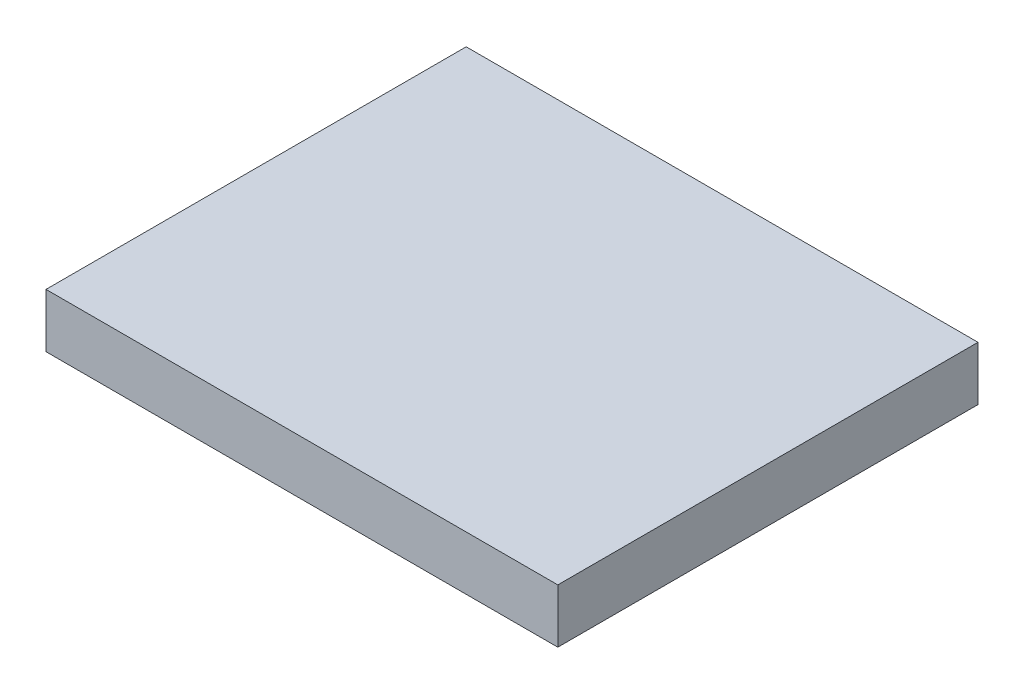
ISO-10303-21;
HEADER;
FILE_DESCRIPTION(('STEP AP214'),'2;1');
FILE_NAME('part.step','',(''),(''),'','','');
FILE_SCHEMA(('AUTOMOTIVE_DESIGN { 1 0 10303 214 1 1 1 1 }'));
ENDSEC;
DATA;
#1=APPLICATION_CONTEXT('core data for automotive mechanical design processes');
#2=APPLICATION_PROTOCOL_DEFINITION('international standard','automotive_design',2000,#1);
#3=PRODUCT_CONTEXT('',#1,'mechanical');
#4=PRODUCT('Part','Part','',(#3));
#5=PRODUCT_RELATED_PRODUCT_CATEGORY('part','',(#4));
#6=PRODUCT_DEFINITION_FORMATION('','',#4);
#7=PRODUCT_DEFINITION_CONTEXT('part definition',#1,'design');
#8=PRODUCT_DEFINITION('design','',#6,#7);
#9=PRODUCT_DEFINITION_SHAPE('','',#8);
#10=(LENGTH_UNIT() NAMED_UNIT(*) SI_UNIT(.MILLI.,.METRE.));
#11=(NAMED_UNIT(*) PLANE_ANGLE_UNIT() SI_UNIT($,.RADIAN.));
#12=(NAMED_UNIT(*) SI_UNIT($,.STERADIAN.) SOLID_ANGLE_UNIT());
#13=UNCERTAINTY_MEASURE_WITH_UNIT(LENGTH_MEASURE(1.E-05),#10,'distance_accuracy_value','');
#14=(GEOMETRIC_REPRESENTATION_CONTEXT(3) GLOBAL_UNCERTAINTY_ASSIGNED_CONTEXT((#13)) GLOBAL_UNIT_ASSIGNED_CONTEXT((#10,
#11,#12)) REPRESENTATION_CONTEXT('',''));
#15=CARTESIAN_POINT('',(0.,0.,0.));
#16=DIRECTION('',(0.,0.,1.));
#17=DIRECTION('',(1.,0.,0.));
#18=AXIS2_PLACEMENT_3D('',#15,#16,#17);
#19=CARTESIAN_POINT('',(-25.810949176075,5.874618009437,0.));
#20=DIRECTION('',(1.,0.,0.));
#21=DIRECTION('',(0.,1.,0.));
#22=AXIS2_PLACEMENT_3D('',#19,#20,#21);
#23=PLANE('',#22);
#24=DIRECTION('',(0.,-1.,0.));
#25=VECTOR('',#24,1.);
#26=CARTESIAN_POINT('',(-25.810949176075,5.887465362914,0.));
#27=LINE('',#26,#25);
#28=CARTESIAN_POINT('',(-25.810949176075,5.887465362914,0.));
#29=VERTEX_POINT('',#28);
#30=CARTESIAN_POINT('',(-25.810949176075,5.874618009437,0.));
#31=VERTEX_POINT('',#30);
#32=EDGE_CURVE('E11',#29,#31,#27,.T.);
#33=ORIENTED_EDGE('',*,*,#32,.F.);
#34=DIRECTION('',(0.,0.,1.));
#35=VECTOR('',#34,1.);
#36=CARTESIAN_POINT('',(-25.810949176075,5.887465362914,0.));
#37=LINE('',#36,#35);
#38=CARTESIAN_POINT('',(-25.810949176075,5.887465362914,0.1));
#39=VERTEX_POINT('',#38);
#40=EDGE_CURVE('E24',#29,#39,#37,.T.);
#41=ORIENTED_EDGE('',*,*,#40,.T.);
#42=DIRECTION('',(0.,1.,0.));
#43=VECTOR('',#42,1.);
#44=CARTESIAN_POINT('',(-25.810949176075,5.887465362914,0.1));
#45=LINE('',#44,#43);
#46=CARTESIAN_POINT('',(-25.810949176075,5.874618009437,0.1));
#47=VERTEX_POINT('',#46);
#48=EDGE_CURVE('E75',#47,#39,#45,.T.);
#49=ORIENTED_EDGE('',*,*,#48,.F.);
#50=DIRECTION('',(0.,0.,1.));
#51=VECTOR('',#50,1.);
#52=CARTESIAN_POINT('',(-25.810949176075,5.874618009437,0.));
#53=LINE('',#52,#51);
#54=EDGE_CURVE('E85',#31,#47,#53,.T.);
#55=ORIENTED_EDGE('',*,*,#54,.F.);
#56=EDGE_LOOP('',(#33,#41,#49,#55));
#57=FACE_BOUND('',#56,.T.);
#58=ADVANCED_FACE('F17',(#57),#23,.T.);
#59=CARTESIAN_POINT('',(-25.932755343422,5.874618009437,0.));
#60=DIRECTION('',(0.,-1.,0.));
#61=DIRECTION('',(1.,0.,0.));
#62=AXIS2_PLACEMENT_3D('',#59,#60,#61);
#63=PLANE('',#62);
#64=DIRECTION('',(-1.,0.,0.));
#65=VECTOR('',#64,1.);
#66=CARTESIAN_POINT('',(-25.810949176075,5.874618009437,0.));
#67=LINE('',#66,#65);
#68=CARTESIAN_POINT('',(-25.932755343422,5.874618009437,0.));
#69=VERTEX_POINT('',#68);
#70=EDGE_CURVE('E83',#31,#69,#67,.T.);
#71=ORIENTED_EDGE('',*,*,#70,.F.);
#72=ORIENTED_EDGE('',*,*,#54,.T.);
#73=DIRECTION('',(1.,0.,0.));
#74=VECTOR('',#73,1.);
#75=CARTESIAN_POINT('',(-25.810949176075,5.874618009437,0.1));
#76=LINE('',#75,#74);
#77=CARTESIAN_POINT('',(-25.932755343422,5.874618009437,0.1));
#78=VERTEX_POINT('',#77);
#79=EDGE_CURVE('E81',#78,#47,#76,.T.);
#80=ORIENTED_EDGE('',*,*,#79,.F.);
#81=DIRECTION('',(0.,0.,1.));
#82=VECTOR('',#81,1.);
#83=CARTESIAN_POINT('',(-25.932755343422,5.874618009437,0.));
#84=LINE('',#83,#82);
#85=EDGE_CURVE('E61',#69,#78,#84,.T.);
#86=ORIENTED_EDGE('',*,*,#85,.F.);
#87=EDGE_LOOP('',(#71,#72,#80,#86));
#88=FACE_BOUND('',#87,.T.);
#89=ADVANCED_FACE('F91',(#88),#63,.T.);
#90=CARTESIAN_POINT('',(-25.932755343422,5.887465362914,0.));
#91=DIRECTION('',(-1.,0.,0.));
#92=DIRECTION('',(0.,-1.,0.));
#93=AXIS2_PLACEMENT_3D('',#90,#91,#92);
#94=PLANE('',#93);
#95=DIRECTION('',(0.,1.,0.));
#96=VECTOR('',#95,1.);
#97=CARTESIAN_POINT('',(-25.932755343422,5.874618009437,0.));
#98=LINE('',#97,#96);
#99=CARTESIAN_POINT('',(-25.932755343422,5.887465362914,0.));
#100=VERTEX_POINT('',#99);
#101=EDGE_CURVE('E65',#69,#100,#98,.T.);
#102=ORIENTED_EDGE('',*,*,#101,.F.);
#103=ORIENTED_EDGE('',*,*,#85,.T.);
#104=DIRECTION('',(0.,-1.,0.));
#105=VECTOR('',#104,1.);
#106=CARTESIAN_POINT('',(-25.932755343422,5.874618009437,0.1));
#107=LINE('',#106,#105);
#108=CARTESIAN_POINT('',(-25.932755343422,5.887465362914,0.1));
#109=VERTEX_POINT('',#108);
#110=EDGE_CURVE('E54',#109,#78,#107,.T.);
#111=ORIENTED_EDGE('',*,*,#110,.F.);
#112=DIRECTION('',(0.,0.,1.));
#113=VECTOR('',#112,1.);
#114=CARTESIAN_POINT('',(-25.932755343422,5.887465362914,0.));
#115=LINE('',#114,#113);
#116=EDGE_CURVE('E58',#100,#109,#115,.T.);
#117=ORIENTED_EDGE('',*,*,#116,.F.);
#118=EDGE_LOOP('',(#102,#103,#111,#117));
#119=FACE_BOUND('',#118,.T.);
#120=ADVANCED_FACE('F57',(#119),#94,.T.);
#121=CARTESIAN_POINT('',(-25.810949176075,5.887465362914,0.));
#122=DIRECTION('',(0.,1.,0.));
#123=DIRECTION('',(-1.,0.,0.));
#124=AXIS2_PLACEMENT_3D('',#121,#122,#123);
#125=PLANE('',#124);
#126=DIRECTION('',(1.,0.,0.));
#127=VECTOR('',#126,1.);
#128=CARTESIAN_POINT('',(-25.932755343422,5.887465362914,0.));
#129=LINE('',#128,#127);
#130=EDGE_CURVE('E71',#100,#29,#129,.T.);
#131=ORIENTED_EDGE('',*,*,#130,.F.);
#132=ORIENTED_EDGE('',*,*,#116,.T.);
#133=DIRECTION('',(-1.,0.,0.));
#134=VECTOR('',#133,1.);
#135=CARTESIAN_POINT('',(-25.932755343422,5.887465362914,0.1));
#136=LINE('',#135,#134);
#137=EDGE_CURVE('E70',#39,#109,#136,.T.);
#138=ORIENTED_EDGE('',*,*,#137,.F.);
#139=ORIENTED_EDGE('',*,*,#40,.F.);
#140=EDGE_LOOP('',(#131,#132,#138,#139));
#141=FACE_BOUND('',#140,.T.);
#142=ADVANCED_FACE('F69',(#141),#125,.T.);
#143=CARTESIAN_POINT('',(-25.871852259748,5.881041686176,0.));
#144=DIRECTION('',(0.,0.,1.));
#145=DIRECTION('',(1.,0.,0.));
#146=AXIS2_PLACEMENT_3D('',#143,#144,#145);
#147=PLANE('',#146);
#148=ORIENTED_EDGE('',*,*,#130,.T.);
#149=ORIENTED_EDGE('',*,*,#32,.T.);
#150=ORIENTED_EDGE('',*,*,#70,.T.);
#151=ORIENTED_EDGE('',*,*,#101,.T.);
#152=EDGE_LOOP('',(#148,#149,#150,#151));
#153=FACE_BOUND('',#152,.T.);
#154=ADVANCED_FACE('F88',(#153),#147,.F.);
#155=CARTESIAN_POINT('',(-25.871852259748,5.881041686176,0.1));
#156=DIRECTION('',(0.,0.,1.));
#157=DIRECTION('',(1.,0.,0.));
#158=AXIS2_PLACEMENT_3D('',#155,#156,#157);
#159=PLANE('',#158);
#160=ORIENTED_EDGE('',*,*,#137,.T.);
#161=ORIENTED_EDGE('',*,*,#110,.T.);
#162=ORIENTED_EDGE('',*,*,#79,.T.);
#163=ORIENTED_EDGE('',*,*,#48,.T.);
#164=EDGE_LOOP('',(#160,#161,#162,#163));
#165=FACE_BOUND('',#164,.T.);
#166=ADVANCED_FACE('F74',(#165),#159,.T.);
#167=CLOSED_SHELL('',(#58,#89,#120,#142,#154,#166));
#168=MANIFOLD_SOLID_BREP('B1',#167);
#169=ADVANCED_BREP_SHAPE_REPRESENTATION('',(#18,#168),#14);
#170=SHAPE_DEFINITION_REPRESENTATION(#9,#169);
ENDSEC;
END-ISO-10303-21;
